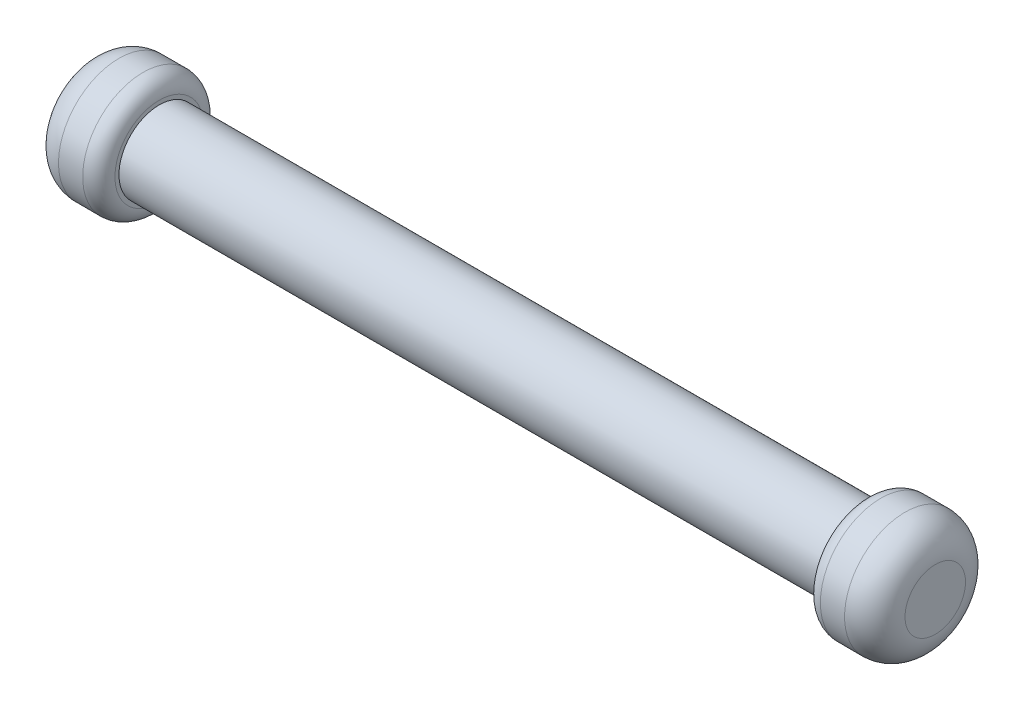
ISO-10303-21;
HEADER;
FILE_DESCRIPTION(('STEP AP214'),'2;1');
FILE_NAME('part.step','',(''),(''),'','','');
FILE_SCHEMA(('AUTOMOTIVE_DESIGN { 1 0 10303 214 1 1 1 1 }'));
ENDSEC;
DATA;
#1=APPLICATION_CONTEXT('core data for automotive mechanical design processes');
#2=APPLICATION_PROTOCOL_DEFINITION('international standard','automotive_design',2000,#1);
#3=PRODUCT_CONTEXT('',#1,'mechanical');
#4=PRODUCT('Part','Part','',(#3));
#5=PRODUCT_RELATED_PRODUCT_CATEGORY('part','',(#4));
#6=PRODUCT_DEFINITION_FORMATION('','',#4);
#7=PRODUCT_DEFINITION_CONTEXT('part definition',#1,'design');
#8=PRODUCT_DEFINITION('design','',#6,#7);
#9=PRODUCT_DEFINITION_SHAPE('','',#8);
#10=(LENGTH_UNIT() NAMED_UNIT(*) SI_UNIT(.MILLI.,.METRE.));
#11=(NAMED_UNIT(*) PLANE_ANGLE_UNIT() SI_UNIT($,.RADIAN.));
#12=(NAMED_UNIT(*) SI_UNIT($,.STERADIAN.) SOLID_ANGLE_UNIT());
#13=UNCERTAINTY_MEASURE_WITH_UNIT(LENGTH_MEASURE(1.E-05),#10,'distance_accuracy_value','');
#14=(GEOMETRIC_REPRESENTATION_CONTEXT(3) GLOBAL_UNCERTAINTY_ASSIGNED_CONTEXT((#13)) GLOBAL_UNIT_ASSIGNED_CONTEXT((#10,
#11,#12)) REPRESENTATION_CONTEXT('',''));
#15=CARTESIAN_POINT('',(0.,0.,0.));
#16=DIRECTION('',(0.,0.,1.));
#17=DIRECTION('',(1.,0.,0.));
#18=AXIS2_PLACEMENT_3D('',#15,#16,#17);
#19=CARTESIAN_POINT('',(0.,0.,0.));
#20=DIRECTION('',(-1.,0.,0.));
#21=DIRECTION('',(0.,0.,1.));
#22=AXIS2_PLACEMENT_3D('',#19,#20,#21);
#23=PLANE('',#22);
#24=CARTESIAN_POINT('',(0.,0.,0.));
#25=DIRECTION('',(-1.,0.,0.));
#26=DIRECTION('',(0.,0.,1.));
#27=AXIS2_PLACEMENT_3D('',#24,#25,#26);
#28=CIRCLE('',#27,1.5);
#29=CARTESIAN_POINT('',(0.,0.,1.5));
#30=VERTEX_POINT('',#29);
#31=EDGE_CURVE('E10',#30,#30,#28,.T.);
#32=ORIENTED_EDGE('',*,*,#31,.T.);
#33=EDGE_LOOP('',(#32));
#34=FACE_BOUND('',#33,.T.);
#35=ADVANCED_FACE('F33',(#34),#23,.T.);
#36=CARTESIAN_POINT('',(0.,0.,0.));
#37=DIRECTION('',(1.,0.,0.));
#38=DIRECTION('',(0.,0.,-1.));
#39=AXIS2_PLACEMENT_3D('',#36,#37,#38);
#40=CYLINDRICAL_SURFACE('',#39,3.);
#41=CARTESIAN_POINT('',(1.5,0.,0.));
#42=DIRECTION('',(-1.,0.,0.));
#43=DIRECTION('',(0.,0.,1.));
#44=AXIS2_PLACEMENT_3D('',#41,#42,#43);
#45=CIRCLE('',#44,3.);
#46=CARTESIAN_POINT('',(1.5,0.,3.));
#47=VERTEX_POINT('',#46);
#48=EDGE_CURVE('E40',#47,#47,#45,.F.);
#49=ORIENTED_EDGE('',*,*,#48,.T.);
#50=EDGE_LOOP('',(#49));
#51=FACE_BOUND('',#50,.T.);
#52=CARTESIAN_POINT('',(2.7,0.,0.));
#53=DIRECTION('',(1.,0.,0.));
#54=DIRECTION('',(0.,0.,-1.));
#55=AXIS2_PLACEMENT_3D('',#52,#53,#54);
#56=CIRCLE('',#55,3.);
#57=CARTESIAN_POINT('',(2.7,0.,-3.));
#58=VERTEX_POINT('',#57);
#59=EDGE_CURVE('E53',#58,#58,#56,.F.);
#60=ORIENTED_EDGE('',*,*,#59,.T.);
#61=EDGE_LOOP('',(#60));
#62=FACE_BOUND('',#61,.T.);
#63=ADVANCED_FACE('F86',(#51,#62),#40,.T.);
#64=CARTESIAN_POINT('',(3.5,3.,0.));
#65=DIRECTION('',(1.,0.,0.));
#66=DIRECTION('',(0.,0.,-1.));
#67=AXIS2_PLACEMENT_3D('',#64,#65,#66);
#68=PLANE('',#67);
#69=CARTESIAN_POINT('',(3.5,0.,0.));
#70=DIRECTION('',(1.,0.,0.));
#71=DIRECTION('',(0.,0.,-1.));
#72=AXIS2_PLACEMENT_3D('',#69,#70,#71);
#73=CIRCLE('',#72,2.2);
#74=CARTESIAN_POINT('',(3.5,0.,-2.2));
#75=VERTEX_POINT('',#74);
#76=EDGE_CURVE('E56',#75,#75,#73,.T.);
#77=ORIENTED_EDGE('',*,*,#76,.T.);
#78=EDGE_LOOP('',(#77));
#79=FACE_BOUND('',#78,.T.);
#80=CARTESIAN_POINT('',(3.5,0.,0.));
#81=DIRECTION('',(1.,0.,0.));
#82=DIRECTION('',(0.,0.,-1.));
#83=AXIS2_PLACEMENT_3D('',#80,#81,#82);
#84=CIRCLE('',#83,2.);
#85=CARTESIAN_POINT('',(3.5,0.,-2.));
#86=VERTEX_POINT('',#85);
#87=EDGE_CURVE('E65',#86,#86,#84,.T.);
#88=ORIENTED_EDGE('',*,*,#87,.F.);
#89=EDGE_LOOP('',(#88));
#90=FACE_BOUND('',#89,.T.);
#91=ADVANCED_FACE('F76',(#79,#90),#68,.T.);
#92=CARTESIAN_POINT('',(0.,0.,0.));
#93=DIRECTION('',(1.,0.,0.));
#94=DIRECTION('',(0.,0.,-1.));
#95=AXIS2_PLACEMENT_3D('',#92,#93,#94);
#96=CYLINDRICAL_SURFACE('',#95,2.);
#97=ORIENTED_EDGE('',*,*,#87,.T.);
#98=EDGE_LOOP('',(#97));
#99=FACE_BOUND('',#98,.T.);
#100=CARTESIAN_POINT('',(38.5,0.,0.));
#101=DIRECTION('',(1.,0.,0.));
#102=DIRECTION('',(0.,0.,-1.));
#103=AXIS2_PLACEMENT_3D('',#100,#101,#102);
#104=CIRCLE('',#103,2.);
#105=CARTESIAN_POINT('',(38.5,0.,-2.));
#106=VERTEX_POINT('',#105);
#107=EDGE_CURVE('E68',#106,#106,#104,.T.);
#108=ORIENTED_EDGE('',*,*,#107,.F.);
#109=EDGE_LOOP('',(#108));
#110=FACE_BOUND('',#109,.T.);
#111=ADVANCED_FACE('F74',(#99,#110),#96,.T.);
#112=CARTESIAN_POINT('',(38.5,2.,0.));
#113=DIRECTION('',(-1.,0.,0.));
#114=DIRECTION('',(0.,0.,1.));
#115=AXIS2_PLACEMENT_3D('',#112,#113,#114);
#116=PLANE('',#115);
#117=CARTESIAN_POINT('',(38.5,0.,0.));
#118=DIRECTION('',(-1.,0.,0.));
#119=DIRECTION('',(0.,0.,1.));
#120=AXIS2_PLACEMENT_3D('',#117,#118,#119);
#121=CIRCLE('',#120,2.20000000000001);
#122=CARTESIAN_POINT('',(38.5,0.,2.20000000000001));
#123=VERTEX_POINT('',#122);
#124=EDGE_CURVE('E59',#123,#123,#121,.T.);
#125=ORIENTED_EDGE('',*,*,#124,.T.);
#126=EDGE_LOOP('',(#125));
#127=FACE_BOUND('',#126,.T.);
#128=ORIENTED_EDGE('',*,*,#107,.T.);
#129=EDGE_LOOP('',(#128));
#130=FACE_BOUND('',#129,.T.);
#131=ADVANCED_FACE('F72',(#127,#130),#116,.T.);
#132=CARTESIAN_POINT('',(0.,0.,0.));
#133=DIRECTION('',(1.,0.,0.));
#134=DIRECTION('',(0.,0.,-1.));
#135=AXIS2_PLACEMENT_3D('',#132,#133,#134);
#136=CYLINDRICAL_SURFACE('',#135,3.00000000000001);
#137=CARTESIAN_POINT('',(40.5,0.,0.));
#138=DIRECTION('',(1.,0.,0.));
#139=DIRECTION('',(0.,0.,-1.));
#140=AXIS2_PLACEMENT_3D('',#137,#138,#139);
#141=CIRCLE('',#140,3.00000000000001);
#142=CARTESIAN_POINT('',(40.5,0.,-3.00000000000001));
#143=VERTEX_POINT('',#142);
#144=EDGE_CURVE('E44',#143,#143,#141,.F.);
#145=ORIENTED_EDGE('',*,*,#144,.T.);
#146=EDGE_LOOP('',(#145));
#147=FACE_BOUND('',#146,.T.);
#148=CARTESIAN_POINT('',(39.3,0.,0.));
#149=DIRECTION('',(-1.,0.,0.));
#150=DIRECTION('',(0.,0.,1.));
#151=AXIS2_PLACEMENT_3D('',#148,#149,#150);
#152=CIRCLE('',#151,3.00000000000001);
#153=CARTESIAN_POINT('',(39.3,0.,3.00000000000001));
#154=VERTEX_POINT('',#153);
#155=EDGE_CURVE('E62',#154,#154,#152,.F.);
#156=ORIENTED_EDGE('',*,*,#155,.T.);
#157=EDGE_LOOP('',(#156));
#158=FACE_BOUND('',#157,.T.);
#159=ADVANCED_FACE('F83',(#147,#158),#136,.T.);
#160=CARTESIAN_POINT('',(42.,3.00000000000001,0.));
#161=DIRECTION('',(1.,0.,0.));
#162=DIRECTION('',(0.,0.,-1.));
#163=AXIS2_PLACEMENT_3D('',#160,#161,#162);
#164=PLANE('',#163);
#165=CARTESIAN_POINT('',(42.,0.,0.));
#166=DIRECTION('',(1.,0.,0.));
#167=DIRECTION('',(0.,0.,-1.));
#168=AXIS2_PLACEMENT_3D('',#165,#166,#167);
#169=CIRCLE('',#168,1.50000000000001);
#170=CARTESIAN_POINT('',(42.,0.,-1.50000000000001));
#171=VERTEX_POINT('',#170);
#172=EDGE_CURVE('E48',#171,#171,#169,.T.);
#173=ORIENTED_EDGE('',*,*,#172,.T.);
#174=EDGE_LOOP('',(#173));
#175=FACE_BOUND('',#174,.T.);
#176=ADVANCED_FACE('F100',(#175),#164,.T.);
#177=CARTESIAN_POINT('',(39.3,0.,0.));
#178=DIRECTION('',(-1.,0.,0.));
#179=DIRECTION('',(0.,0.,1.));
#180=AXIS2_PLACEMENT_3D('',#177,#178,#179);
#181=TOROIDAL_SURFACE('',#180,2.20000000000001,0.8);
#182=ORIENTED_EDGE('',*,*,#124,.F.);
#183=EDGE_LOOP('',(#182));
#184=FACE_BOUND('',#183,.T.);
#185=ORIENTED_EDGE('',*,*,#155,.F.);
#186=EDGE_LOOP('',(#185));
#187=FACE_BOUND('',#186,.T.);
#188=ADVANCED_FACE('F96',(#184,#187),#181,.T.);
#189=CARTESIAN_POINT('',(2.7,0.,0.));
#190=DIRECTION('',(1.,0.,0.));
#191=DIRECTION('',(0.,0.,-1.));
#192=AXIS2_PLACEMENT_3D('',#189,#190,#191);
#193=TOROIDAL_SURFACE('',#192,2.2,0.8);
#194=ORIENTED_EDGE('',*,*,#59,.F.);
#195=EDGE_LOOP('',(#194));
#196=FACE_BOUND('',#195,.T.);
#197=ORIENTED_EDGE('',*,*,#76,.F.);
#198=EDGE_LOOP('',(#197));
#199=FACE_BOUND('',#198,.T.);
#200=ADVANCED_FACE('F99',(#196,#199),#193,.T.);
#201=CARTESIAN_POINT('',(40.5,0.,0.));
#202=DIRECTION('',(1.,0.,0.));
#203=DIRECTION('',(0.,0.,-1.));
#204=AXIS2_PLACEMENT_3D('',#201,#202,#203);
#205=TOROIDAL_SURFACE('',#204,1.50000000000001,1.5);
#206=ORIENTED_EDGE('',*,*,#144,.F.);
#207=EDGE_LOOP('',(#206));
#208=FACE_BOUND('',#207,.T.);
#209=ORIENTED_EDGE('',*,*,#172,.F.);
#210=EDGE_LOOP('',(#209));
#211=FACE_BOUND('',#210,.T.);
#212=ADVANCED_FACE('F103',(#208,#211),#205,.T.);
#213=CARTESIAN_POINT('',(1.5,0.,0.));
#214=DIRECTION('',(-1.,0.,0.));
#215=DIRECTION('',(0.,0.,1.));
#216=AXIS2_PLACEMENT_3D('',#213,#214,#215);
#217=DEGENERATE_TOROIDAL_SURFACE('',#216,1.5,1.5,.T.);
#218=ORIENTED_EDGE('',*,*,#31,.F.);
#219=EDGE_LOOP('',(#218));
#220=FACE_BOUND('',#219,.T.);
#221=ORIENTED_EDGE('',*,*,#48,.F.);
#222=EDGE_LOOP('',(#221));
#223=FACE_BOUND('',#222,.T.);
#224=ADVANCED_FACE('F35',(#220,#223),#217,.T.);
#225=CLOSED_SHELL('',(#35,#63,#91,#111,#131,#159,#176,#188,#200,#212,#224));
#226=MANIFOLD_SOLID_BREP('B2',#225);
#227=ADVANCED_BREP_SHAPE_REPRESENTATION('',(#18,#226),#14);
#228=SHAPE_DEFINITION_REPRESENTATION(#9,#227);
ENDSEC;
END-ISO-10303-21;
